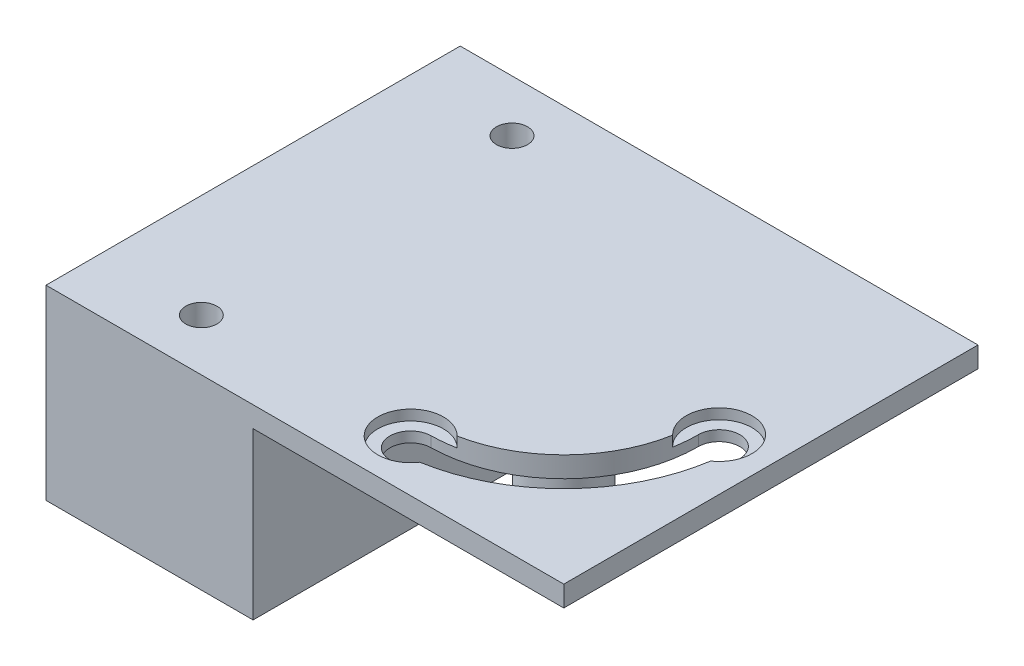
ISO-10303-21;
HEADER;
FILE_DESCRIPTION(('STEP AP214'),'2;1');
FILE_NAME('part.step','',(''),(''),'','','');
FILE_SCHEMA(('AUTOMOTIVE_DESIGN { 1 0 10303 214 1 1 1 1 }'));
ENDSEC;
DATA;
#1=APPLICATION_CONTEXT('core data for automotive mechanical design processes');
#2=APPLICATION_PROTOCOL_DEFINITION('international standard','automotive_design',2000,#1);
#3=PRODUCT_CONTEXT('',#1,'mechanical');
#4=PRODUCT('Part','Part','',(#3));
#5=PRODUCT_RELATED_PRODUCT_CATEGORY('part','',(#4));
#6=PRODUCT_DEFINITION_FORMATION('','',#4);
#7=PRODUCT_DEFINITION_CONTEXT('part definition',#1,'design');
#8=PRODUCT_DEFINITION('design','',#6,#7);
#9=PRODUCT_DEFINITION_SHAPE('','',#8);
#10=(LENGTH_UNIT() NAMED_UNIT(*) SI_UNIT(.MILLI.,.METRE.));
#11=(NAMED_UNIT(*) PLANE_ANGLE_UNIT() SI_UNIT($,.RADIAN.));
#12=(NAMED_UNIT(*) SI_UNIT($,.STERADIAN.) SOLID_ANGLE_UNIT());
#13=UNCERTAINTY_MEASURE_WITH_UNIT(LENGTH_MEASURE(1.E-05),#10,'distance_accuracy_value','');
#14=(GEOMETRIC_REPRESENTATION_CONTEXT(3) GLOBAL_UNCERTAINTY_ASSIGNED_CONTEXT((#13)) GLOBAL_UNIT_ASSIGNED_CONTEXT((#10,
#11,#12)) REPRESENTATION_CONTEXT('',''));
#15=CARTESIAN_POINT('',(0.,0.,0.));
#16=DIRECTION('',(0.,0.,1.));
#17=DIRECTION('',(1.,0.,0.));
#18=AXIS2_PLACEMENT_3D('',#15,#16,#17);
#19=CARTESIAN_POINT('',(25.,-12.,0.));
#20=DIRECTION('',(0.,1.,0.));
#21=DIRECTION('',(0.,0.,1.));
#22=AXIS2_PLACEMENT_3D('',#19,#20,#21);
#23=CYLINDRICAL_SURFACE('',#22,2.);
#24=CARTESIAN_POINT('',(25.,1.,0.));
#25=DIRECTION('',(0.,1.,0.));
#26=DIRECTION('',(0.,0.,1.));
#27=AXIS2_PLACEMENT_3D('',#24,#25,#26);
#28=CIRCLE('',#27,2.);
#29=CARTESIAN_POINT('',(23.,1.,0.));
#30=VERTEX_POINT('',#29);
#31=CARTESIAN_POINT('',(27.,1.,0.));
#32=VERTEX_POINT('',#31);
#33=EDGE_CURVE('E249',#30,#32,#28,.F.);
#34=ORIENTED_EDGE('',*,*,#33,.F.);
#35=DIRECTION('',(0.,1.,0.));
#36=VECTOR('',#35,1.);
#37=CARTESIAN_POINT('',(23.,-12.,0.));
#38=LINE('',#37,#36);
#39=CARTESIAN_POINT('',(23.,0.,0.));
#40=VERTEX_POINT('',#39);
#41=EDGE_CURVE('E210',#40,#30,#38,.T.);
#42=ORIENTED_EDGE('',*,*,#41,.F.);
#43=CARTESIAN_POINT('',(25.,0.,0.));
#44=DIRECTION('',(0.,1.,0.));
#45=DIRECTION('',(0.,0.,1.));
#46=AXIS2_PLACEMENT_3D('',#43,#44,#45);
#47=CIRCLE('',#46,2.);
#48=CARTESIAN_POINT('',(27.,0.,0.));
#49=VERTEX_POINT('',#48);
#50=EDGE_CURVE('E180',#49,#40,#47,.T.);
#51=ORIENTED_EDGE('',*,*,#50,.F.);
#52=DIRECTION('',(0.,1.,0.));
#53=VECTOR('',#52,1.);
#54=CARTESIAN_POINT('',(27.,-12.,0.));
#55=LINE('',#54,#53);
#56=EDGE_CURVE('E164',#49,#32,#55,.T.);
#57=ORIENTED_EDGE('',*,*,#56,.T.);
#58=EDGE_LOOP('',(#34,#42,#51,#57));
#59=FACE_BOUND('',#58,.T.);
#60=ADVANCED_FACE('F32',(#59),#23,.F.);
#61=CARTESIAN_POINT('',(10.2106779913152,-12.,14.9985204198273));
#62=DIRECTION('',(0.,1.,0.));
#63=DIRECTION('',(0.,0.,1.));
#64=AXIS2_PLACEMENT_3D('',#61,#62,#63);
#65=CYLINDRICAL_SURFACE('',#64,2.);
#66=CARTESIAN_POINT('',(10.2106779913152,1.,14.9985204198273));
#67=DIRECTION('',(0.,1.,0.));
#68=DIRECTION('',(0.,0.,1.));
#69=AXIS2_PLACEMENT_3D('',#66,#67,#68);
#70=CIRCLE('',#69,2.);
#71=CARTESIAN_POINT('',(10.2387683901572,1.,16.9983231424709));
#72=VERTEX_POINT('',#71);
#73=CARTESIAN_POINT('',(10.1825875924732,1.,12.9987176971836));
#74=VERTEX_POINT('',#73);
#75=EDGE_CURVE('E239',#72,#74,#70,.F.);
#76=ORIENTED_EDGE('',*,*,#75,.F.);
#77=DIRECTION('',(0.,1.,0.));
#78=VECTOR('',#77,1.);
#79=CARTESIAN_POINT('',(10.2387683901572,-12.,16.9983231424709));
#80=LINE('',#79,#78);
#81=CARTESIAN_POINT('',(10.2387683901572,0.,16.9983231424709));
#82=VERTEX_POINT('',#81);
#83=EDGE_CURVE('E219',#82,#72,#80,.T.);
#84=ORIENTED_EDGE('',*,*,#83,.F.);
#85=CARTESIAN_POINT('',(10.2106779913152,0.,14.9985204198273));
#86=DIRECTION('',(0.,1.,0.));
#87=DIRECTION('',(0.,0.,1.));
#88=AXIS2_PLACEMENT_3D('',#85,#86,#87);
#89=CIRCLE('',#88,2.);
#90=CARTESIAN_POINT('',(10.1825875924732,0.,12.9987176971836));
#91=VERTEX_POINT('',#90);
#92=EDGE_CURVE('E174',#91,#82,#89,.T.);
#93=ORIENTED_EDGE('',*,*,#92,.F.);
#94=DIRECTION('',(0.,1.,0.));
#95=VECTOR('',#94,1.);
#96=CARTESIAN_POINT('',(10.1825875924732,-12.,12.9987176971836));
#97=LINE('',#96,#95);
#98=EDGE_CURVE('E222',#91,#74,#97,.T.);
#99=ORIENTED_EDGE('',*,*,#98,.T.);
#100=EDGE_LOOP('',(#76,#84,#93,#99));
#101=FACE_BOUND('',#100,.T.);
#102=ADVANCED_FACE('F274',(#101),#65,.F.);
#103=CARTESIAN_POINT('',(0.,0.,0.));
#104=DIRECTION('',(0.,1.,0.));
#105=DIRECTION('',(0.,0.,1.));
#106=AXIS2_PLACEMENT_3D('',#103,#104,#105);
#107=PLANE('',#106);
#108=CARTESIAN_POINT('',(10.,0.,0.));
#109=DIRECTION('',(0.,1.,0.));
#110=DIRECTION('',(0.,0.,1.));
#111=AXIS2_PLACEMENT_3D('',#108,#109,#110);
#112=CIRCLE('',#111,3.5);
#113=CARTESIAN_POINT('',(10.,0.,3.50000000000001));
#114=VERTEX_POINT('',#113);
#115=EDGE_CURVE('E183',#114,#114,#112,.F.);
#116=ORIENTED_EDGE('',*,*,#115,.F.);
#117=EDGE_LOOP('',(#116));
#118=FACE_BOUND('',#117,.T.);
#119=CARTESIAN_POINT('',(10.,0.,0.));
#120=DIRECTION('',(0.,1.,0.));
#121=DIRECTION('',(0.,0.,1.));
#122=AXIS2_PLACEMENT_3D('',#119,#120,#121);
#123=CIRCLE('',#122,17.);
#124=EDGE_CURVE('E177',#82,#49,#123,.T.);
#125=ORIENTED_EDGE('',*,*,#124,.T.);
#126=ORIENTED_EDGE('',*,*,#50,.T.);
#127=CARTESIAN_POINT('',(10.,0.,0.));
#128=DIRECTION('',(0.,1.,0.));
#129=DIRECTION('',(0.,0.,1.));
#130=AXIS2_PLACEMENT_3D('',#127,#128,#129);
#131=CIRCLE('',#130,13.);
#132=EDGE_CURVE('E171',#40,#91,#131,.F.);
#133=ORIENTED_EDGE('',*,*,#132,.T.);
#134=ORIENTED_EDGE('',*,*,#92,.T.);
#135=EDGE_LOOP('',(#125,#126,#133,#134));
#136=FACE_BOUND('',#135,.T.);
#137=DIRECTION('',(0.,0.,1.));
#138=VECTOR('',#137,1.);
#139=CARTESIAN_POINT('',(0.,0.,20.));
#140=LINE('',#139,#138);
#141=CARTESIAN_POINT('',(0.,0.,-20.));
#142=VERTEX_POINT('',#141);
#143=CARTESIAN_POINT('',(0.,0.,20.));
#144=VERTEX_POINT('',#143);
#145=EDGE_CURVE('E259',#142,#144,#140,.T.);
#146=ORIENTED_EDGE('',*,*,#145,.F.);
#147=DIRECTION('',(-1.,0.,0.));
#148=VECTOR('',#147,1.);
#149=CARTESIAN_POINT('',(-30.,0.,-20.));
#150=LINE('',#149,#148);
#151=CARTESIAN_POINT('',(30.,0.,-20.));
#152=VERTEX_POINT('',#151);
#153=EDGE_CURVE('E163',#152,#142,#150,.T.);
#154=ORIENTED_EDGE('',*,*,#153,.F.);
#155=DIRECTION('',(0.,0.,-1.));
#156=VECTOR('',#155,1.);
#157=CARTESIAN_POINT('',(30.,0.,-20.));
#158=LINE('',#157,#156);
#159=CARTESIAN_POINT('',(30.,0.,20.));
#160=VERTEX_POINT('',#159);
#161=EDGE_CURVE('E160',#160,#152,#158,.T.);
#162=ORIENTED_EDGE('',*,*,#161,.F.);
#163=DIRECTION('',(1.,0.,0.));
#164=VECTOR('',#163,1.);
#165=CARTESIAN_POINT('',(-30.,0.,20.));
#166=LINE('',#165,#164);
#167=EDGE_CURVE('E167',#144,#160,#166,.T.);
#168=ORIENTED_EDGE('',*,*,#167,.F.);
#169=EDGE_LOOP('',(#146,#154,#162,#168));
#170=FACE_BOUND('',#169,.T.);
#171=ADVANCED_FACE('F272',(#118,#136,#170),#107,.F.);
#172=CARTESIAN_POINT('',(0.,2.,0.));
#173=DIRECTION('',(0.,1.,0.));
#174=DIRECTION('',(0.,0.,1.));
#175=AXIS2_PLACEMENT_3D('',#172,#173,#174);
#176=PLANE('',#175);
#177=CARTESIAN_POINT('',(-10.,2.,-15.));
#178=DIRECTION('',(0.,1.,0.));
#179=DIRECTION('',(0.,0.,1.));
#180=AXIS2_PLACEMENT_3D('',#177,#178,#179);
#181=CIRCLE('',#180,1.49999999999999);
#182=CARTESIAN_POINT('',(-10.,2.,-13.5));
#183=VERTEX_POINT('',#182);
#184=EDGE_CURVE('E346',#183,#183,#181,.T.);
#185=ORIENTED_EDGE('',*,*,#184,.F.);
#186=EDGE_LOOP('',(#185));
#187=FACE_BOUND('',#186,.T.);
#188=CARTESIAN_POINT('',(-10.,2.,15.));
#189=DIRECTION('',(0.,1.,0.));
#190=DIRECTION('',(0.,0.,1.));
#191=AXIS2_PLACEMENT_3D('',#188,#189,#190);
#192=CIRCLE('',#191,1.49999999999999);
#193=CARTESIAN_POINT('',(-10.,2.,16.5));
#194=VERTEX_POINT('',#193);
#195=EDGE_CURVE('E348',#194,#194,#192,.T.);
#196=ORIENTED_EDGE('',*,*,#195,.F.);
#197=EDGE_LOOP('',(#196));
#198=FACE_BOUND('',#197,.T.);
#199=DIRECTION('',(0.,0.,-1.));
#200=VECTOR('',#199,1.);
#201=CARTESIAN_POINT('',(-20.,2.,-20.));
#202=LINE('',#201,#200);
#203=CARTESIAN_POINT('',(-20.,2.,20.));
#204=VERTEX_POINT('',#203);
#205=CARTESIAN_POINT('',(-20.,2.,-20.));
#206=VERTEX_POINT('',#205);
#207=EDGE_CURVE('E133',#204,#206,#202,.T.);
#208=ORIENTED_EDGE('',*,*,#207,.F.);
#209=DIRECTION('',(1.,0.,0.));
#210=VECTOR('',#209,1.);
#211=CARTESIAN_POINT('',(-30.,2.,20.));
#212=LINE('',#211,#210);
#213=CARTESIAN_POINT('',(30.,2.,20.));
#214=VERTEX_POINT('',#213);
#215=EDGE_CURVE('E144',#204,#214,#212,.T.);
#216=ORIENTED_EDGE('',*,*,#215,.T.);
#217=DIRECTION('',(0.,0.,-1.));
#218=VECTOR('',#217,1.);
#219=CARTESIAN_POINT('',(30.,2.,-20.));
#220=LINE('',#219,#218);
#221=CARTESIAN_POINT('',(30.,2.,-20.));
#222=VERTEX_POINT('',#221);
#223=EDGE_CURVE('E156',#214,#222,#220,.T.);
#224=ORIENTED_EDGE('',*,*,#223,.T.);
#225=DIRECTION('',(-1.,0.,0.));
#226=VECTOR('',#225,1.);
#227=CARTESIAN_POINT('',(-30.,2.,-20.));
#228=LINE('',#227,#226);
#229=EDGE_CURVE('E146',#222,#206,#228,.T.);
#230=ORIENTED_EDGE('',*,*,#229,.T.);
#231=EDGE_LOOP('',(#208,#216,#224,#230));
#232=FACE_BOUND('',#231,.T.);
#233=CARTESIAN_POINT('',(25.,2.,0.));
#234=DIRECTION('',(0.,1.,0.));
#235=DIRECTION('',(0.,0.,1.));
#236=AXIS2_PLACEMENT_3D('',#233,#234,#235);
#237=CIRCLE('',#236,3.175);
#238=CARTESIAN_POINT('',(26.7973125,2.,2.61730639729929));
#239=VERTEX_POINT('',#238);
#240=CARTESIAN_POINT('',(22.7973125,2.,2.28665536916777));
#241=VERTEX_POINT('',#240);
#242=EDGE_CURVE('E204',#239,#241,#237,.T.);
#243=ORIENTED_EDGE('',*,*,#242,.F.);
#244=CARTESIAN_POINT('',(10.,2.,0.));
#245=DIRECTION('',(0.,1.,0.));
#246=DIRECTION('',(0.,0.,-1.));
#247=AXIS2_PLACEMENT_3D('',#244,#245,#246);
#248=CIRCLE('',#247,17.);
#249=CARTESIAN_POINT('',(12.8529698334554,2.,16.758895045002));
#250=VERTEX_POINT('',#249);
#251=EDGE_CURVE('E207',#250,#239,#248,.T.);
#252=ORIENTED_EDGE('',*,*,#251,.F.);
#253=CARTESIAN_POINT('',(10.2106779913152,2.,14.9985204198273));
#254=DIRECTION('',(0.,1.,0.));
#255=DIRECTION('',(0.,0.,1.));
#256=AXIS2_PLACEMENT_3D('',#253,#254,#255);
#257=CIRCLE('',#256,3.175);
#258=CARTESIAN_POINT('',(12.4661706226202,2.,12.7639336593436));
#259=VERTEX_POINT('',#258);
#260=EDGE_CURVE('E206',#259,#250,#257,.T.);
#261=ORIENTED_EDGE('',*,*,#260,.F.);
#262=CARTESIAN_POINT('',(10.,2.,0.));
#263=DIRECTION('',(0.,-1.,0.));
#264=DIRECTION('',(0.,0.,-1.));
#265=AXIS2_PLACEMENT_3D('',#262,#263,#264);
#266=CIRCLE('',#265,13.);
#267=EDGE_CURVE('E198',#241,#259,#266,.T.);
#268=ORIENTED_EDGE('',*,*,#267,.F.);
#269=EDGE_LOOP('',(#243,#252,#261,#268));
#270=FACE_BOUND('',#269,.T.);
#271=ADVANCED_FACE('F141',(#187,#198,#232,#270),#176,.T.);
#272=CARTESIAN_POINT('',(30.,2.,-20.));
#273=DIRECTION('',(-1.,0.,0.));
#274=DIRECTION('',(0.,0.,1.));
#275=AXIS2_PLACEMENT_3D('',#272,#273,#274);
#276=PLANE('',#275);
#277=ORIENTED_EDGE('',*,*,#161,.T.);
#278=DIRECTION('',(0.,-1.,0.));
#279=VECTOR('',#278,1.);
#280=CARTESIAN_POINT('',(30.,2.,-20.));
#281=LINE('',#280,#279);
#282=EDGE_CURVE('E154',#222,#152,#281,.T.);
#283=ORIENTED_EDGE('',*,*,#282,.F.);
#284=ORIENTED_EDGE('',*,*,#223,.F.);
#285=DIRECTION('',(0.,-1.,0.));
#286=VECTOR('',#285,1.);
#287=CARTESIAN_POINT('',(30.,2.,20.));
#288=LINE('',#287,#286);
#289=EDGE_CURVE('E151',#214,#160,#288,.T.);
#290=ORIENTED_EDGE('',*,*,#289,.T.);
#291=EDGE_LOOP('',(#277,#283,#284,#290));
#292=FACE_BOUND('',#291,.T.);
#293=ADVANCED_FACE('F34',(#292),#276,.F.);
#294=CARTESIAN_POINT('',(-30.,2.,-20.));
#295=DIRECTION('',(0.,0.,1.));
#296=DIRECTION('',(1.,0.,0.));
#297=AXIS2_PLACEMENT_3D('',#294,#295,#296);
#298=PLANE('',#297);
#299=DIRECTION('',(1.,0.,0.));
#300=VECTOR('',#299,1.);
#301=CARTESIAN_POINT('',(0.,-16.,-20.));
#302=LINE('',#301,#300);
#303=CARTESIAN_POINT('',(-20.,-16.,-20.));
#304=VERTEX_POINT('',#303);
#305=CARTESIAN_POINT('',(0.,-16.,-20.));
#306=VERTEX_POINT('',#305);
#307=EDGE_CURVE('E232',#304,#306,#302,.T.);
#308=ORIENTED_EDGE('',*,*,#307,.F.);
#309=DIRECTION('',(0.,1.,0.));
#310=VECTOR('',#309,1.);
#311=CARTESIAN_POINT('',(-20.,-28.,-20.));
#312=LINE('',#311,#310);
#313=EDGE_CURVE('E46',#304,#206,#312,.T.);
#314=ORIENTED_EDGE('',*,*,#313,.T.);
#315=ORIENTED_EDGE('',*,*,#229,.F.);
#316=ORIENTED_EDGE('',*,*,#282,.T.);
#317=ORIENTED_EDGE('',*,*,#153,.T.);
#318=DIRECTION('',(0.,1.,0.));
#319=VECTOR('',#318,1.);
#320=CARTESIAN_POINT('',(0.,-16.,-20.));
#321=LINE('',#320,#319);
#322=EDGE_CURVE('E208',#306,#142,#321,.T.);
#323=ORIENTED_EDGE('',*,*,#322,.F.);
#324=EDGE_LOOP('',(#308,#314,#315,#316,#317,#323));
#325=FACE_BOUND('',#324,.T.);
#326=ADVANCED_FACE('F230',(#325),#298,.F.);
#327=CARTESIAN_POINT('',(-30.,2.,20.));
#328=DIRECTION('',(0.,0.,-1.));
#329=DIRECTION('',(-1.,0.,0.));
#330=AXIS2_PLACEMENT_3D('',#327,#328,#329);
#331=PLANE('',#330);
#332=ORIENTED_EDGE('',*,*,#215,.F.);
#333=DIRECTION('',(0.,1.,0.));
#334=VECTOR('',#333,1.);
#335=CARTESIAN_POINT('',(-20.,-28.,20.));
#336=LINE('',#335,#334);
#337=CARTESIAN_POINT('',(-20.,-16.,20.));
#338=VERTEX_POINT('',#337);
#339=EDGE_CURVE('E130',#338,#204,#336,.T.);
#340=ORIENTED_EDGE('',*,*,#339,.F.);
#341=DIRECTION('',(-1.,0.,0.));
#342=VECTOR('',#341,1.);
#343=CARTESIAN_POINT('',(0.,-16.,20.));
#344=LINE('',#343,#342);
#345=CARTESIAN_POINT('',(0.,-16.,20.));
#346=VERTEX_POINT('',#345);
#347=EDGE_CURVE('E260',#346,#338,#344,.T.);
#348=ORIENTED_EDGE('',*,*,#347,.F.);
#349=DIRECTION('',(0.,1.,0.));
#350=VECTOR('',#349,1.);
#351=CARTESIAN_POINT('',(0.,-16.,20.));
#352=LINE('',#351,#350);
#353=EDGE_CURVE('E213',#346,#144,#352,.T.);
#354=ORIENTED_EDGE('',*,*,#353,.T.);
#355=ORIENTED_EDGE('',*,*,#167,.T.);
#356=ORIENTED_EDGE('',*,*,#289,.F.);
#357=EDGE_LOOP('',(#332,#340,#348,#354,#355,#356));
#358=FACE_BOUND('',#357,.T.);
#359=ADVANCED_FACE('F149',(#358),#331,.F.);
#360=CARTESIAN_POINT('',(10.,-12.,0.));
#361=DIRECTION('',(0.,1.,0.));
#362=DIRECTION('',(0.,0.,1.));
#363=AXIS2_PLACEMENT_3D('',#360,#361,#362);
#364=CYLINDRICAL_SURFACE('',#363,17.);
#365=ORIENTED_EDGE('',*,*,#251,.T.);
#366=DIRECTION('',(0.,1.,0.));
#367=VECTOR('',#366,1.);
#368=CARTESIAN_POINT('',(26.7973125,1.5,2.61730639729929));
#369=LINE('',#368,#367);
#370=CARTESIAN_POINT('',(26.7973125,1.,2.61730639729929));
#371=VERTEX_POINT('',#370);
#372=EDGE_CURVE('E253',#239,#371,#369,.F.);
#373=ORIENTED_EDGE('',*,*,#372,.T.);
#374=CARTESIAN_POINT('',(10.,1.,0.));
#375=DIRECTION('',(0.,1.,0.));
#376=DIRECTION('',(0.,0.,1.));
#377=AXIS2_PLACEMENT_3D('',#374,#375,#376);
#378=CIRCLE('',#377,17.);
#379=EDGE_CURVE('E251',#32,#371,#378,.F.);
#380=ORIENTED_EDGE('',*,*,#379,.F.);
#381=ORIENTED_EDGE('',*,*,#56,.F.);
#382=ORIENTED_EDGE('',*,*,#124,.F.);
#383=ORIENTED_EDGE('',*,*,#83,.T.);
#384=CARTESIAN_POINT('',(10.,1.,0.));
#385=DIRECTION('',(0.,1.,0.));
#386=DIRECTION('',(0.,0.,1.));
#387=AXIS2_PLACEMENT_3D('',#384,#385,#386);
#388=CIRCLE('',#387,17.);
#389=CARTESIAN_POINT('',(12.8529698334554,1.,16.758895045002));
#390=VERTEX_POINT('',#389);
#391=EDGE_CURVE('E244',#390,#72,#388,.F.);
#392=ORIENTED_EDGE('',*,*,#391,.F.);
#393=DIRECTION('',(0.,1.,0.));
#394=VECTOR('',#393,1.);
#395=CARTESIAN_POINT('',(12.8529698334554,1.5,16.758895045002));
#396=LINE('',#395,#394);
#397=EDGE_CURVE('E246',#390,#250,#396,.T.);
#398=ORIENTED_EDGE('',*,*,#397,.T.);
#399=EDGE_LOOP('',(#365,#373,#380,#381,#382,#383,#392,#398));
#400=FACE_BOUND('',#399,.T.);
#401=ADVANCED_FACE('F296',(#400),#364,.F.);
#402=CARTESIAN_POINT('',(10.,-12.,0.));
#403=DIRECTION('',(0.,1.,0.));
#404=DIRECTION('',(0.,0.,1.));
#405=AXIS2_PLACEMENT_3D('',#402,#403,#404);
#406=CYLINDRICAL_SURFACE('',#405,13.);
#407=CARTESIAN_POINT('',(10.,1.,0.));
#408=DIRECTION('',(0.,1.,0.));
#409=DIRECTION('',(0.,0.,1.));
#410=AXIS2_PLACEMENT_3D('',#407,#408,#409);
#411=CIRCLE('',#410,13.);
#412=CARTESIAN_POINT('',(22.7973125,1.,2.28665536916777));
#413=VERTEX_POINT('',#412);
#414=EDGE_CURVE('E191',#413,#30,#411,.T.);
#415=ORIENTED_EDGE('',*,*,#414,.F.);
#416=DIRECTION('',(0.,1.,0.));
#417=VECTOR('',#416,1.);
#418=CARTESIAN_POINT('',(22.7973125,1.5,2.28665536916777));
#419=LINE('',#418,#417);
#420=EDGE_CURVE('E40',#413,#241,#419,.T.);
#421=ORIENTED_EDGE('',*,*,#420,.T.);
#422=ORIENTED_EDGE('',*,*,#267,.T.);
#423=DIRECTION('',(0.,1.,0.));
#424=VECTOR('',#423,1.);
#425=CARTESIAN_POINT('',(12.4661706226202,1.5,12.7639336593436));
#426=LINE('',#425,#424);
#427=CARTESIAN_POINT('',(12.4661706226202,1.,12.7639336593436));
#428=VERTEX_POINT('',#427);
#429=EDGE_CURVE('E188',#259,#428,#426,.F.);
#430=ORIENTED_EDGE('',*,*,#429,.T.);
#431=CARTESIAN_POINT('',(10.,1.,0.));
#432=DIRECTION('',(0.,1.,0.));
#433=DIRECTION('',(0.,0.,1.));
#434=AXIS2_PLACEMENT_3D('',#431,#432,#433);
#435=CIRCLE('',#434,13.);
#436=EDGE_CURVE('E186',#74,#428,#435,.T.);
#437=ORIENTED_EDGE('',*,*,#436,.F.);
#438=ORIENTED_EDGE('',*,*,#98,.F.);
#439=ORIENTED_EDGE('',*,*,#132,.F.);
#440=ORIENTED_EDGE('',*,*,#41,.T.);
#441=EDGE_LOOP('',(#415,#421,#422,#430,#437,#438,#439,#440));
#442=FACE_BOUND('',#441,.T.);
#443=ADVANCED_FACE('F197',(#442),#406,.T.);
#444=CARTESIAN_POINT('',(0.,-16.,20.));
#445=DIRECTION('',(-1.,0.,0.));
#446=DIRECTION('',(0.,0.,1.));
#447=AXIS2_PLACEMENT_3D('',#444,#445,#446);
#448=PLANE('',#447);
#449=ORIENTED_EDGE('',*,*,#145,.T.);
#450=ORIENTED_EDGE('',*,*,#353,.F.);
#451=DIRECTION('',(0.,0.,1.));
#452=VECTOR('',#451,1.);
#453=CARTESIAN_POINT('',(0.,-16.,20.));
#454=LINE('',#453,#452);
#455=EDGE_CURVE('E263',#306,#346,#454,.T.);
#456=ORIENTED_EDGE('',*,*,#455,.F.);
#457=ORIENTED_EDGE('',*,*,#322,.T.);
#458=EDGE_LOOP('',(#449,#450,#456,#457));
#459=FACE_BOUND('',#458,.T.);
#460=ADVANCED_FACE('F270',(#459),#448,.F.);
#461=CARTESIAN_POINT('',(0.,-16.,0.));
#462=DIRECTION('',(0.,-1.,0.));
#463=DIRECTION('',(0.,0.,-1.));
#464=AXIS2_PLACEMENT_3D('',#461,#462,#463);
#465=PLANE('',#464);
#466=CARTESIAN_POINT('',(-10.,-16.,-15.));
#467=DIRECTION('',(0.,1.,0.));
#468=DIRECTION('',(0.,0.,1.));
#469=AXIS2_PLACEMENT_3D('',#466,#467,#468);
#470=CIRCLE('',#469,1.5);
#471=CARTESIAN_POINT('',(-10.,-16.,-13.5));
#472=VERTEX_POINT('',#471);
#473=EDGE_CURVE('E343',#472,#472,#470,.T.);
#474=ORIENTED_EDGE('',*,*,#473,.T.);
#475=EDGE_LOOP('',(#474));
#476=FACE_BOUND('',#475,.T.);
#477=CARTESIAN_POINT('',(-10.,-16.,15.));
#478=DIRECTION('',(0.,1.,0.));
#479=DIRECTION('',(0.,0.,1.));
#480=AXIS2_PLACEMENT_3D('',#477,#478,#479);
#481=CIRCLE('',#480,1.5);
#482=CARTESIAN_POINT('',(-10.,-16.,16.5));
#483=VERTEX_POINT('',#482);
#484=EDGE_CURVE('E147',#483,#483,#481,.T.);
#485=ORIENTED_EDGE('',*,*,#484,.T.);
#486=EDGE_LOOP('',(#485));
#487=FACE_BOUND('',#486,.T.);
#488=DIRECTION('',(0.,0.,1.));
#489=VECTOR('',#488,1.);
#490=CARTESIAN_POINT('',(-20.,-16.,0.));
#491=LINE('',#490,#489);
#492=EDGE_CURVE('E11',#304,#338,#491,.T.);
#493=ORIENTED_EDGE('',*,*,#492,.F.);
#494=ORIENTED_EDGE('',*,*,#307,.T.);
#495=ORIENTED_EDGE('',*,*,#455,.T.);
#496=ORIENTED_EDGE('',*,*,#347,.T.);
#497=EDGE_LOOP('',(#493,#494,#495,#496));
#498=FACE_BOUND('',#497,.T.);
#499=ADVANCED_FACE('F303',(#476,#487,#498),#465,.T.);
#500=CARTESIAN_POINT('',(10.,-16.,0.));
#501=DIRECTION('',(0.,1.,0.));
#502=DIRECTION('',(0.,0.,1.));
#503=AXIS2_PLACEMENT_3D('',#500,#501,#502);
#504=CYLINDRICAL_SURFACE('',#503,3.5);
#505=CARTESIAN_POINT('',(10.,-16.,0.));
#506=DIRECTION('',(0.,-1.,0.));
#507=DIRECTION('',(0.,0.,-1.));
#508=AXIS2_PLACEMENT_3D('',#505,#506,#507);
#509=CIRCLE('',#508,3.5);
#510=CARTESIAN_POINT('',(10.,-16.,-3.49999999999999));
#511=VERTEX_POINT('',#510);
#512=EDGE_CURVE('E256',#511,#511,#509,.T.);
#513=ORIENTED_EDGE('',*,*,#512,.F.);
#514=EDGE_LOOP('',(#513));
#515=FACE_BOUND('',#514,.T.);
#516=ORIENTED_EDGE('',*,*,#115,.T.);
#517=EDGE_LOOP('',(#516));
#518=FACE_BOUND('',#517,.T.);
#519=ADVANCED_FACE('F306',(#515,#518),#504,.T.);
#520=CARTESIAN_POINT('',(10.,-16.,0.));
#521=DIRECTION('',(0.,-1.,0.));
#522=DIRECTION('',(0.,0.,-1.));
#523=AXIS2_PLACEMENT_3D('',#520,#521,#522);
#524=PLANE('',#523);
#525=ORIENTED_EDGE('',*,*,#512,.T.);
#526=EDGE_LOOP('',(#525));
#527=FACE_BOUND('',#526,.T.);
#528=ADVANCED_FACE('F310',(#527),#524,.T.);
#529=CARTESIAN_POINT('',(10.2106779913152,1.,14.9985204198273));
#530=DIRECTION('',(0.,1.,0.));
#531=DIRECTION('',(0.,0.,1.));
#532=AXIS2_PLACEMENT_3D('',#529,#530,#531);
#533=CYLINDRICAL_SURFACE('',#532,3.175);
#534=CARTESIAN_POINT('',(10.2106779913152,1.,14.9985204198273));
#535=DIRECTION('',(0.,1.,0.));
#536=DIRECTION('',(0.,0.,1.));
#537=AXIS2_PLACEMENT_3D('',#534,#535,#536);
#538=CIRCLE('',#537,3.175);
#539=EDGE_CURVE('E234',#428,#390,#538,.T.);
#540=ORIENTED_EDGE('',*,*,#539,.F.);
#541=ORIENTED_EDGE('',*,*,#429,.F.);
#542=ORIENTED_EDGE('',*,*,#260,.T.);
#543=ORIENTED_EDGE('',*,*,#397,.F.);
#544=EDGE_LOOP('',(#540,#541,#542,#543));
#545=FACE_BOUND('',#544,.T.);
#546=ADVANCED_FACE('F314',(#545),#533,.F.);
#547=CARTESIAN_POINT('',(10.2106779913152,1.,14.9985204198273));
#548=DIRECTION('',(0.,1.,0.));
#549=DIRECTION('',(0.,0.,1.));
#550=AXIS2_PLACEMENT_3D('',#547,#548,#549);
#551=PLANE('',#550);
#552=ORIENTED_EDGE('',*,*,#391,.T.);
#553=ORIENTED_EDGE('',*,*,#75,.T.);
#554=ORIENTED_EDGE('',*,*,#436,.T.);
#555=ORIENTED_EDGE('',*,*,#539,.T.);
#556=EDGE_LOOP('',(#552,#553,#554,#555));
#557=FACE_BOUND('',#556,.T.);
#558=ADVANCED_FACE('F318',(#557),#551,.T.);
#559=CARTESIAN_POINT('',(25.,1.,0.));
#560=DIRECTION('',(0.,1.,0.));
#561=DIRECTION('',(0.,0.,1.));
#562=AXIS2_PLACEMENT_3D('',#559,#560,#561);
#563=CYLINDRICAL_SURFACE('',#562,3.175);
#564=ORIENTED_EDGE('',*,*,#242,.T.);
#565=ORIENTED_EDGE('',*,*,#420,.F.);
#566=CARTESIAN_POINT('',(25.,1.,0.));
#567=DIRECTION('',(0.,1.,0.));
#568=DIRECTION('',(0.,0.,1.));
#569=AXIS2_PLACEMENT_3D('',#566,#567,#568);
#570=CIRCLE('',#569,3.175);
#571=EDGE_CURVE('E54',#371,#413,#570,.T.);
#572=ORIENTED_EDGE('',*,*,#571,.F.);
#573=ORIENTED_EDGE('',*,*,#372,.F.);
#574=EDGE_LOOP('',(#564,#565,#572,#573));
#575=FACE_BOUND('',#574,.T.);
#576=ADVANCED_FACE('F322',(#575),#563,.F.);
#577=CARTESIAN_POINT('',(25.,1.,0.));
#578=DIRECTION('',(0.,1.,0.));
#579=DIRECTION('',(0.,0.,1.));
#580=AXIS2_PLACEMENT_3D('',#577,#578,#579);
#581=PLANE('',#580);
#582=ORIENTED_EDGE('',*,*,#379,.T.);
#583=ORIENTED_EDGE('',*,*,#571,.T.);
#584=ORIENTED_EDGE('',*,*,#414,.T.);
#585=ORIENTED_EDGE('',*,*,#33,.T.);
#586=EDGE_LOOP('',(#582,#583,#584,#585));
#587=FACE_BOUND('',#586,.T.);
#588=ADVANCED_FACE('F326',(#587),#581,.T.);
#589=CARTESIAN_POINT('',(-20.,-28.,-20.));
#590=DIRECTION('',(1.,0.,0.));
#591=DIRECTION('',(0.,0.,-1.));
#592=AXIS2_PLACEMENT_3D('',#589,#590,#591);
#593=PLANE('',#592);
#594=ORIENTED_EDGE('',*,*,#492,.T.);
#595=ORIENTED_EDGE('',*,*,#339,.T.);
#596=ORIENTED_EDGE('',*,*,#207,.T.);
#597=ORIENTED_EDGE('',*,*,#313,.F.);
#598=EDGE_LOOP('',(#594,#595,#596,#597));
#599=FACE_BOUND('',#598,.T.);
#600=ADVANCED_FACE('F132',(#599),#593,.F.);
#601=CARTESIAN_POINT('',(-10.,2.,15.));
#602=DIRECTION('',(0.,1.,0.));
#603=DIRECTION('',(0.,0.,1.));
#604=AXIS2_PLACEMENT_3D('',#601,#602,#603);
#605=CYLINDRICAL_SURFACE('',#604,1.49999999999999);
#606=ORIENTED_EDGE('',*,*,#484,.F.);
#607=EDGE_LOOP('',(#606));
#608=FACE_BOUND('',#607,.T.);
#609=ORIENTED_EDGE('',*,*,#195,.T.);
#610=EDGE_LOOP('',(#609));
#611=FACE_BOUND('',#610,.T.);
#612=ADVANCED_FACE('F331',(#608,#611),#605,.F.);
#613=CARTESIAN_POINT('',(-10.,2.,-15.));
#614=DIRECTION('',(0.,1.,0.));
#615=DIRECTION('',(0.,0.,1.));
#616=AXIS2_PLACEMENT_3D('',#613,#614,#615);
#617=CYLINDRICAL_SURFACE('',#616,1.49999999999999);
#618=ORIENTED_EDGE('',*,*,#473,.F.);
#619=EDGE_LOOP('',(#618));
#620=FACE_BOUND('',#619,.T.);
#621=ORIENTED_EDGE('',*,*,#184,.T.);
#622=EDGE_LOOP('',(#621));
#623=FACE_BOUND('',#622,.T.);
#624=ADVANCED_FACE('F334',(#620,#623),#617,.F.);
#625=CLOSED_SHELL('',(#60,#102,#171,#271,#293,#326,#359,#401,#443,#460,#499,#519,#528,#546,#558,
#576,#588,#600,#612,#624));
#626=MANIFOLD_SOLID_BREP('B2',#625);
#627=ADVANCED_BREP_SHAPE_REPRESENTATION('',(#18,#626),#14);
#628=SHAPE_DEFINITION_REPRESENTATION(#9,#627);
ENDSEC;
END-ISO-10303-21;
